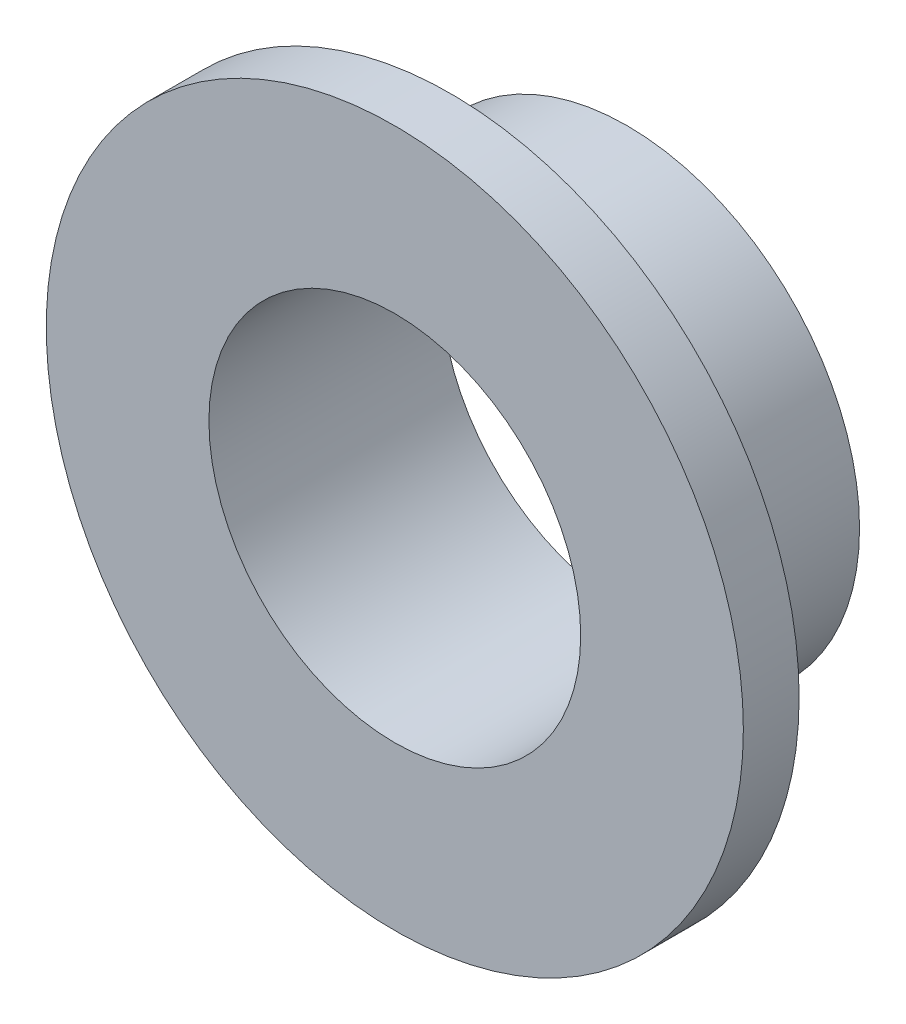
ISO-10303-21;
HEADER;
FILE_DESCRIPTION(('STEP AP214'),'2;1');
FILE_NAME('part.step','',(''),(''),'','','');
FILE_SCHEMA(('AUTOMOTIVE_DESIGN { 1 0 10303 214 1 1 1 1 }'));
ENDSEC;
DATA;
#1=APPLICATION_CONTEXT('core data for automotive mechanical design processes');
#2=APPLICATION_PROTOCOL_DEFINITION('international standard','automotive_design',2000,#1);
#3=PRODUCT_CONTEXT('',#1,'mechanical');
#4=PRODUCT('Part','Part','',(#3));
#5=PRODUCT_RELATED_PRODUCT_CATEGORY('part','',(#4));
#6=PRODUCT_DEFINITION_FORMATION('','',#4);
#7=PRODUCT_DEFINITION_CONTEXT('part definition',#1,'design');
#8=PRODUCT_DEFINITION('design','',#6,#7);
#9=PRODUCT_DEFINITION_SHAPE('','',#8);
#10=(LENGTH_UNIT() NAMED_UNIT(*) SI_UNIT(.MILLI.,.METRE.));
#11=(NAMED_UNIT(*) PLANE_ANGLE_UNIT() SI_UNIT($,.RADIAN.));
#12=(NAMED_UNIT(*) SI_UNIT($,.STERADIAN.) SOLID_ANGLE_UNIT());
#13=UNCERTAINTY_MEASURE_WITH_UNIT(LENGTH_MEASURE(1.E-05),#10,'distance_accuracy_value','');
#14=(GEOMETRIC_REPRESENTATION_CONTEXT(3) GLOBAL_UNCERTAINTY_ASSIGNED_CONTEXT((#13)) GLOBAL_UNIT_ASSIGNED_CONTEXT((#10,
#11,#12)) REPRESENTATION_CONTEXT('',''));
#15=CARTESIAN_POINT('',(0.,0.,0.));
#16=DIRECTION('',(0.,0.,1.));
#17=DIRECTION('',(1.,0.,0.));
#18=AXIS2_PLACEMENT_3D('',#15,#16,#17);
#19=CARTESIAN_POINT('',(0.,0.,0.));
#20=DIRECTION('',(0.,0.,1.));
#21=DIRECTION('',(1.,0.,0.));
#22=AXIS2_PLACEMENT_3D('',#19,#20,#21);
#23=CYLINDRICAL_SURFACE('',#22,4.);
#24=CARTESIAN_POINT('',(0.,0.,-5.));
#25=DIRECTION('',(0.,0.,1.));
#26=DIRECTION('',(1.,0.,0.));
#27=AXIS2_PLACEMENT_3D('',#24,#25,#26);
#28=CIRCLE('',#27,4.);
#29=CARTESIAN_POINT('',(4.,0.,-5.));
#30=VERTEX_POINT('',#29);
#31=EDGE_CURVE('E57',#30,#30,#28,.T.);
#32=ORIENTED_EDGE('',*,*,#31,.F.);
#33=EDGE_LOOP('',(#32));
#34=FACE_BOUND('',#33,.T.);
#35=CARTESIAN_POINT('',(0.,0.,0.));
#36=DIRECTION('',(0.,0.,1.));
#37=DIRECTION('',(1.,0.,0.));
#38=AXIS2_PLACEMENT_3D('',#35,#36,#37);
#39=CIRCLE('',#38,4.);
#40=CARTESIAN_POINT('',(4.,0.,0.));
#41=VERTEX_POINT('',#40);
#42=EDGE_CURVE('E10',#41,#41,#39,.T.);
#43=ORIENTED_EDGE('',*,*,#42,.T.);
#44=EDGE_LOOP('',(#43));
#45=FACE_BOUND('',#44,.T.);
#46=ADVANCED_FACE('F35',(#34,#45),#23,.F.);
#47=CARTESIAN_POINT('',(0.,4.,0.));
#48=DIRECTION('',(0.,0.,-1.));
#49=DIRECTION('',(-1.,0.,0.));
#50=AXIS2_PLACEMENT_3D('',#47,#48,#49);
#51=PLANE('',#50);
#52=ORIENTED_EDGE('',*,*,#42,.F.);
#53=EDGE_LOOP('',(#52));
#54=FACE_BOUND('',#53,.T.);
#55=CARTESIAN_POINT('',(0.,0.,0.));
#56=DIRECTION('',(0.,0.,1.));
#57=DIRECTION('',(1.,0.,0.));
#58=AXIS2_PLACEMENT_3D('',#55,#56,#57);
#59=CIRCLE('',#58,7.5);
#60=CARTESIAN_POINT('',(7.5,0.,0.));
#61=VERTEX_POINT('',#60);
#62=EDGE_CURVE('E41',#61,#61,#59,.T.);
#63=ORIENTED_EDGE('',*,*,#62,.T.);
#64=EDGE_LOOP('',(#63));
#65=FACE_BOUND('',#64,.T.);
#66=ADVANCED_FACE('F64',(#54,#65),#51,.F.);
#67=CARTESIAN_POINT('',(0.,0.,0.));
#68=DIRECTION('',(0.,0.,1.));
#69=DIRECTION('',(1.,0.,0.));
#70=AXIS2_PLACEMENT_3D('',#67,#68,#69);
#71=CYLINDRICAL_SURFACE('',#70,7.5);
#72=ORIENTED_EDGE('',*,*,#62,.F.);
#73=EDGE_LOOP('',(#72));
#74=FACE_BOUND('',#73,.T.);
#75=CARTESIAN_POINT('',(0.,0.,-1.2));
#76=DIRECTION('',(0.,0.,1.));
#77=DIRECTION('',(1.,0.,0.));
#78=AXIS2_PLACEMENT_3D('',#75,#76,#77);
#79=CIRCLE('',#78,7.5);
#80=CARTESIAN_POINT('',(7.5,0.,-1.2));
#81=VERTEX_POINT('',#80);
#82=EDGE_CURVE('E45',#81,#81,#79,.T.);
#83=ORIENTED_EDGE('',*,*,#82,.T.);
#84=EDGE_LOOP('',(#83));
#85=FACE_BOUND('',#84,.T.);
#86=ADVANCED_FACE('F68',(#74,#85),#71,.T.);
#87=CARTESIAN_POINT('',(0.,7.5,-1.2));
#88=DIRECTION('',(0.,0.,1.));
#89=DIRECTION('',(1.,0.,0.));
#90=AXIS2_PLACEMENT_3D('',#87,#88,#89);
#91=PLANE('',#90);
#92=ORIENTED_EDGE('',*,*,#82,.F.);
#93=EDGE_LOOP('',(#92));
#94=FACE_BOUND('',#93,.T.);
#95=CARTESIAN_POINT('',(0.,0.,-1.2));
#96=DIRECTION('',(0.,0.,1.));
#97=DIRECTION('',(1.,0.,0.));
#98=AXIS2_PLACEMENT_3D('',#95,#96,#97);
#99=CIRCLE('',#98,5.);
#100=CARTESIAN_POINT('',(5.,0.,-1.2));
#101=VERTEX_POINT('',#100);
#102=EDGE_CURVE('E49',#101,#101,#99,.T.);
#103=ORIENTED_EDGE('',*,*,#102,.T.);
#104=EDGE_LOOP('',(#103));
#105=FACE_BOUND('',#104,.T.);
#106=ADVANCED_FACE('F73',(#94,#105),#91,.F.);
#107=CARTESIAN_POINT('',(0.,0.,0.));
#108=DIRECTION('',(0.,0.,1.));
#109=DIRECTION('',(1.,0.,0.));
#110=AXIS2_PLACEMENT_3D('',#107,#108,#109);
#111=CYLINDRICAL_SURFACE('',#110,5.);
#112=ORIENTED_EDGE('',*,*,#102,.F.);
#113=EDGE_LOOP('',(#112));
#114=FACE_BOUND('',#113,.T.);
#115=CARTESIAN_POINT('',(0.,0.,-5.));
#116=DIRECTION('',(0.,0.,1.));
#117=DIRECTION('',(1.,0.,0.));
#118=AXIS2_PLACEMENT_3D('',#115,#116,#117);
#119=CIRCLE('',#118,5.);
#120=CARTESIAN_POINT('',(5.,0.,-5.));
#121=VERTEX_POINT('',#120);
#122=EDGE_CURVE('E54',#121,#121,#119,.T.);
#123=ORIENTED_EDGE('',*,*,#122,.T.);
#124=EDGE_LOOP('',(#123));
#125=FACE_BOUND('',#124,.T.);
#126=ADVANCED_FACE('F79',(#114,#125),#111,.T.);
#127=CARTESIAN_POINT('',(0.,5.,-5.));
#128=DIRECTION('',(0.,0.,1.));
#129=DIRECTION('',(1.,0.,0.));
#130=AXIS2_PLACEMENT_3D('',#127,#128,#129);
#131=PLANE('',#130);
#132=ORIENTED_EDGE('',*,*,#122,.F.);
#133=EDGE_LOOP('',(#132));
#134=FACE_BOUND('',#133,.T.);
#135=ORIENTED_EDGE('',*,*,#31,.T.);
#136=EDGE_LOOP('',(#135));
#137=FACE_BOUND('',#136,.T.);
#138=ADVANCED_FACE('F61',(#134,#137),#131,.F.);
#139=CLOSED_SHELL('',(#46,#66,#86,#106,#126,#138));
#140=MANIFOLD_SOLID_BREP('B2',#139);
#141=ADVANCED_BREP_SHAPE_REPRESENTATION('',(#18,#140),#14);
#142=SHAPE_DEFINITION_REPRESENTATION(#9,#141);
ENDSEC;
END-ISO-10303-21;
